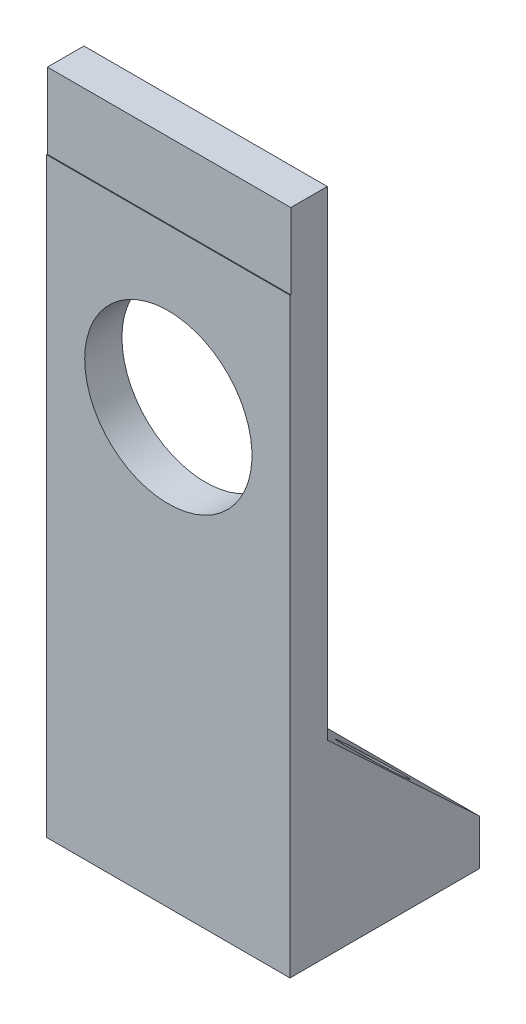
ISO-10303-21;
HEADER;
FILE_DESCRIPTION(('STEP AP214'),'2;1');
FILE_NAME('part.step','',(''),(''),'','','');
FILE_SCHEMA(('AUTOMOTIVE_DESIGN { 1 0 10303 214 1 1 1 1 }'));
ENDSEC;
DATA;
#1=APPLICATION_CONTEXT('core data for automotive mechanical design processes');
#2=APPLICATION_PROTOCOL_DEFINITION('international standard','automotive_design',2000,#1);
#3=PRODUCT_CONTEXT('',#1,'mechanical');
#4=PRODUCT('Part','Part','',(#3));
#5=PRODUCT_RELATED_PRODUCT_CATEGORY('part','',(#4));
#6=PRODUCT_DEFINITION_FORMATION('','',#4);
#7=PRODUCT_DEFINITION_CONTEXT('part definition',#1,'design');
#8=PRODUCT_DEFINITION('design','',#6,#7);
#9=PRODUCT_DEFINITION_SHAPE('','',#8);
#10=(LENGTH_UNIT() NAMED_UNIT(*) SI_UNIT(.MILLI.,.METRE.));
#11=(NAMED_UNIT(*) PLANE_ANGLE_UNIT() SI_UNIT($,.RADIAN.));
#12=(NAMED_UNIT(*) SI_UNIT($,.STERADIAN.) SOLID_ANGLE_UNIT());
#13=UNCERTAINTY_MEASURE_WITH_UNIT(LENGTH_MEASURE(1.E-05),#10,'distance_accuracy_value','');
#14=(GEOMETRIC_REPRESENTATION_CONTEXT(3) GLOBAL_UNCERTAINTY_ASSIGNED_CONTEXT((#13)) GLOBAL_UNIT_ASSIGNED_CONTEXT((#10,
#11,#12)) REPRESENTATION_CONTEXT('',''));
#15=CARTESIAN_POINT('',(0.,0.,0.));
#16=DIRECTION('',(0.,0.,1.));
#17=DIRECTION('',(1.,0.,0.));
#18=AXIS2_PLACEMENT_3D('',#15,#16,#17);
#19=CARTESIAN_POINT('',(0.,0.,0.));
#20=DIRECTION('',(0.,0.,1.));
#21=DIRECTION('',(1.,0.,0.));
#22=AXIS2_PLACEMENT_3D('',#19,#20,#21);
#23=PLANE('',#22);
#24=CARTESIAN_POINT('',(70.,72.0000000000001,0.));
#25=DIRECTION('',(0.,0.,1.));
#26=DIRECTION('',(1.,0.,0.));
#27=AXIS2_PLACEMENT_3D('',#24,#25,#26);
#28=CIRCLE('',#27,11.);
#29=CARTESIAN_POINT('',(81.,72.0000000000001,0.));
#30=VERTEX_POINT('',#29);
#31=EDGE_CURVE('E167',#30,#30,#28,.T.);
#32=ORIENTED_EDGE('',*,*,#31,.T.);
#33=EDGE_LOOP('',(#32));
#34=FACE_BOUND('',#33,.T.);
#35=DIRECTION('',(0.,1.,0.));
#36=VECTOR('',#35,1.);
#37=CARTESIAN_POINT('',(86.,102.7,0.));
#38=LINE('',#37,#36);
#39=CARTESIAN_POINT('',(86.,39.631523057082,0.));
#40=VERTEX_POINT('',#39);
#41=CARTESIAN_POINT('',(86.,102.7,0.));
#42=VERTEX_POINT('',#41);
#43=EDGE_CURVE('E145',#40,#42,#38,.T.);
#44=ORIENTED_EDGE('',*,*,#43,.F.);
#45=DIRECTION('',(1.,0.,0.));
#46=VECTOR('',#45,1.);
#47=CARTESIAN_POINT('',(54.,39.6315230570821,0.));
#48=LINE('',#47,#46);
#49=CARTESIAN_POINT('',(54.,39.6315230570821,0.));
#50=VERTEX_POINT('',#49);
#51=EDGE_CURVE('E124',#50,#40,#48,.T.);
#52=ORIENTED_EDGE('',*,*,#51,.F.);
#53=DIRECTION('',(0.,-1.,0.));
#54=VECTOR('',#53,1.);
#55=CARTESIAN_POINT('',(54.,0.,0.));
#56=LINE('',#55,#54);
#57=CARTESIAN_POINT('',(54.,102.7,0.));
#58=VERTEX_POINT('',#57);
#59=EDGE_CURVE('E123',#58,#50,#56,.T.);
#60=ORIENTED_EDGE('',*,*,#59,.F.);
#61=DIRECTION('',(-1.,0.,0.));
#62=VECTOR('',#61,1.);
#63=CARTESIAN_POINT('',(0.,102.7,0.));
#64=LINE('',#63,#62);
#65=EDGE_CURVE('E164',#42,#58,#64,.T.);
#66=ORIENTED_EDGE('',*,*,#65,.F.);
#67=EDGE_LOOP('',(#44,#52,#60,#66));
#68=FACE_BOUND('',#67,.T.);
#69=ADVANCED_FACE('F35',(#34,#68),#23,.F.);
#70=CARTESIAN_POINT('',(0.,0.,4.8));
#71=DIRECTION('',(0.,0.,1.));
#72=DIRECTION('',(1.,0.,0.));
#73=AXIS2_PLACEMENT_3D('',#70,#71,#72);
#74=PLANE('',#73);
#75=DIRECTION('',(0.,-1.,0.));
#76=VECTOR('',#75,1.);
#77=CARTESIAN_POINT('',(86.,0.,4.8));
#78=LINE('',#77,#76);
#79=CARTESIAN_POINT('',(86.,102.7,4.8));
#80=VERTEX_POINT('',#79);
#81=CARTESIAN_POINT('',(86.,92.7631774285374,4.79999999999999));
#82=VERTEX_POINT('',#81);
#83=EDGE_CURVE('E153',#80,#82,#78,.T.);
#84=ORIENTED_EDGE('',*,*,#83,.F.);
#85=DIRECTION('',(-1.,0.,0.));
#86=VECTOR('',#85,1.);
#87=CARTESIAN_POINT('',(0.,102.7,4.8));
#88=LINE('',#87,#86);
#89=CARTESIAN_POINT('',(54.,102.7,4.8));
#90=VERTEX_POINT('',#89);
#91=EDGE_CURVE('E165',#80,#90,#88,.T.);
#92=ORIENTED_EDGE('',*,*,#91,.T.);
#93=DIRECTION('',(0.,1.,0.));
#94=VECTOR('',#93,1.);
#95=CARTESIAN_POINT('',(54.,0.,4.8));
#96=LINE('',#95,#94);
#97=CARTESIAN_POINT('',(54.,92.7631774285374,4.79999999999999));
#98=VERTEX_POINT('',#97);
#99=EDGE_CURVE('E159',#98,#90,#96,.T.);
#100=ORIENTED_EDGE('',*,*,#99,.F.);
#101=DIRECTION('',(1.,0.,0.));
#102=VECTOR('',#101,1.);
#103=CARTESIAN_POINT('',(0.,92.7631774285374,4.8));
#104=LINE('',#103,#102);
#105=EDGE_CURVE('E161',#98,#82,#104,.T.);
#106=ORIENTED_EDGE('',*,*,#105,.T.);
#107=EDGE_LOOP('',(#84,#92,#100,#106));
#108=FACE_BOUND('',#107,.T.);
#109=ADVANCED_FACE('F209',(#108),#74,.T.);
#110=CARTESIAN_POINT('',(0.,102.7,4.8));
#111=DIRECTION('',(0.,-1.,0.));
#112=DIRECTION('',(1.,0.,0.));
#113=AXIS2_PLACEMENT_3D('',#110,#111,#112);
#114=PLANE('',#113);
#115=ORIENTED_EDGE('',*,*,#91,.F.);
#116=DIRECTION('',(0.,0.,-1.));
#117=VECTOR('',#116,1.);
#118=CARTESIAN_POINT('',(86.,102.7,100.));
#119=LINE('',#118,#117);
#120=EDGE_CURVE('E147',#80,#42,#119,.T.);
#121=ORIENTED_EDGE('',*,*,#120,.T.);
#122=ORIENTED_EDGE('',*,*,#65,.T.);
#123=DIRECTION('',(0.,0.,-1.));
#124=VECTOR('',#123,1.);
#125=CARTESIAN_POINT('',(54.,102.7,100.));
#126=LINE('',#125,#124);
#127=EDGE_CURVE('E156',#90,#58,#126,.T.);
#128=ORIENTED_EDGE('',*,*,#127,.F.);
#129=EDGE_LOOP('',(#115,#121,#122,#128));
#130=FACE_BOUND('',#129,.T.);
#131=ADVANCED_FACE('F37',(#130),#114,.F.);
#132=CARTESIAN_POINT('',(70.,72.0000000000001,4.8));
#133=DIRECTION('',(0.,0.,-1.));
#134=DIRECTION('',(-1.,0.,0.));
#135=AXIS2_PLACEMENT_3D('',#132,#133,#134);
#136=CYLINDRICAL_SURFACE('',#135,11.);
#137=CARTESIAN_POINT('',(70.,72.0000000000001,4.9));
#138=DIRECTION('',(0.,0.,-1.));
#139=DIRECTION('',(-1.,0.,0.));
#140=AXIS2_PLACEMENT_3D('',#137,#138,#139);
#141=CIRCLE('',#140,11.);
#142=CARTESIAN_POINT('',(59.,72.0000000000001,4.9));
#143=VERTEX_POINT('',#142);
#144=EDGE_CURVE('E142',#143,#143,#141,.T.);
#145=ORIENTED_EDGE('',*,*,#144,.F.);
#146=EDGE_LOOP('',(#145));
#147=FACE_BOUND('',#146,.T.);
#148=ORIENTED_EDGE('',*,*,#31,.F.);
#149=EDGE_LOOP('',(#148));
#150=FACE_BOUND('',#149,.T.);
#151=ADVANCED_FACE('F223',(#147,#150),#136,.F.);
#152=CARTESIAN_POINT('',(0.,92.7631774285374,13.));
#153=DIRECTION('',(0.,1.,0.));
#154=DIRECTION('',(-1.,0.,0.));
#155=AXIS2_PLACEMENT_3D('',#152,#153,#154);
#156=PLANE('',#155);
#157=DIRECTION('',(1.,0.,0.));
#158=VECTOR('',#157,1.);
#159=CARTESIAN_POINT('',(-14.,92.7631774285374,4.9));
#160=LINE('',#159,#158);
#161=CARTESIAN_POINT('',(54.,92.7631774285374,4.9));
#162=VERTEX_POINT('',#161);
#163=CARTESIAN_POINT('',(86.,92.7631774285374,4.9));
#164=VERTEX_POINT('',#163);
#165=EDGE_CURVE('E136',#162,#164,#160,.T.);
#166=ORIENTED_EDGE('',*,*,#165,.T.);
#167=DIRECTION('',(0.,0.,1.));
#168=VECTOR('',#167,1.);
#169=CARTESIAN_POINT('',(86.,92.7631774285374,13.));
#170=LINE('',#169,#168);
#171=EDGE_CURVE('E150',#82,#164,#170,.T.);
#172=ORIENTED_EDGE('',*,*,#171,.F.);
#173=ORIENTED_EDGE('',*,*,#105,.F.);
#174=DIRECTION('',(0.,0.,-1.));
#175=VECTOR('',#174,1.);
#176=CARTESIAN_POINT('',(54.,92.7631774285374,13.));
#177=LINE('',#176,#175);
#178=EDGE_CURVE('E60',#162,#98,#177,.T.);
#179=ORIENTED_EDGE('',*,*,#178,.F.);
#180=EDGE_LOOP('',(#166,#172,#173,#179));
#181=FACE_BOUND('',#180,.T.);
#182=ADVANCED_FACE('F205',(#181),#156,.T.);
#183=CARTESIAN_POINT('',(0.,15.,-90.2));
#184=DIRECTION('',(0.,1.,0.));
#185=DIRECTION('',(0.,0.,1.));
#186=AXIS2_PLACEMENT_3D('',#183,#184,#185);
#187=PLANE('',#186);
#188=CARTESIAN_POINT('',(80.,15.,-12.));
#189=DIRECTION('',(0.,1.,0.));
#190=DIRECTION('',(0.,0.,1.));
#191=AXIS2_PLACEMENT_3D('',#188,#189,#190);
#192=CIRCLE('',#191,2.);
#193=CARTESIAN_POINT('',(80.,15.,-10.));
#194=VERTEX_POINT('',#193);
#195=EDGE_CURVE('E196',#194,#194,#192,.T.);
#196=ORIENTED_EDGE('',*,*,#195,.T.);
#197=EDGE_LOOP('',(#196));
#198=FACE_BOUND('',#197,.T.);
#199=CARTESIAN_POINT('',(60.,15.,-12.));
#200=DIRECTION('',(0.,1.,0.));
#201=DIRECTION('',(0.,0.,1.));
#202=AXIS2_PLACEMENT_3D('',#199,#200,#201);
#203=CIRCLE('',#202,2.);
#204=CARTESIAN_POINT('',(60.,15.,-10.));
#205=VERTEX_POINT('',#204);
#206=EDGE_CURVE('E189',#205,#205,#203,.T.);
#207=ORIENTED_EDGE('',*,*,#206,.T.);
#208=EDGE_LOOP('',(#207));
#209=FACE_BOUND('',#208,.T.);
#210=DIRECTION('',(0.,0.,1.));
#211=VECTOR('',#210,1.);
#212=CARTESIAN_POINT('',(86.,15.,-90.2));
#213=LINE('',#212,#211);
#214=CARTESIAN_POINT('',(86.,15.,-20.));
#215=VERTEX_POINT('',#214);
#216=CARTESIAN_POINT('',(86.,15.,4.9));
#217=VERTEX_POINT('',#216);
#218=EDGE_CURVE('E11',#215,#217,#213,.T.);
#219=ORIENTED_EDGE('',*,*,#218,.T.);
#220=DIRECTION('',(1.,0.,0.));
#221=VECTOR('',#220,1.);
#222=CARTESIAN_POINT('',(-14.,15.,4.9));
#223=LINE('',#222,#221);
#224=CARTESIAN_POINT('',(54.,15.,4.9));
#225=VERTEX_POINT('',#224);
#226=EDGE_CURVE('E52',#225,#217,#223,.T.);
#227=ORIENTED_EDGE('',*,*,#226,.F.);
#228=DIRECTION('',(0.,0.,-1.));
#229=VECTOR('',#228,1.);
#230=CARTESIAN_POINT('',(54.,15.,-90.2));
#231=LINE('',#230,#229);
#232=CARTESIAN_POINT('',(54.,15.,-20.));
#233=VERTEX_POINT('',#232);
#234=EDGE_CURVE('E44',#225,#233,#231,.T.);
#235=ORIENTED_EDGE('',*,*,#234,.T.);
#236=DIRECTION('',(-1.,0.,0.));
#237=VECTOR('',#236,1.);
#238=CARTESIAN_POINT('',(86.,15.,-20.));
#239=LINE('',#238,#237);
#240=EDGE_CURVE('E129',#215,#233,#239,.T.);
#241=ORIENTED_EDGE('',*,*,#240,.F.);
#242=EDGE_LOOP('',(#219,#227,#235,#241));
#243=FACE_BOUND('',#242,.T.);
#244=ADVANCED_FACE('F202',(#198,#209,#243),#187,.F.);
#245=CARTESIAN_POINT('',(54.,0.,100.));
#246=DIRECTION('',(1.,0.,0.));
#247=DIRECTION('',(0.,1.,0.));
#248=AXIS2_PLACEMENT_3D('',#245,#246,#247);
#249=PLANE('',#248);
#250=ORIENTED_EDGE('',*,*,#234,.F.);
#251=DIRECTION('',(0.,1.,0.));
#252=VECTOR('',#251,1.);
#253=CARTESIAN_POINT('',(54.,0.,4.9));
#254=LINE('',#253,#252);
#255=EDGE_CURVE('E139',#225,#162,#254,.T.);
#256=ORIENTED_EDGE('',*,*,#255,.T.);
#257=ORIENTED_EDGE('',*,*,#178,.T.);
#258=ORIENTED_EDGE('',*,*,#99,.T.);
#259=ORIENTED_EDGE('',*,*,#127,.T.);
#260=ORIENTED_EDGE('',*,*,#59,.T.);
#261=DIRECTION('',(0.,0.681630805143284,0.731696279531145));
#262=VECTOR('',#261,1.);
#263=CARTESIAN_POINT('',(54.,21.,-20.));
#264=LINE('',#263,#262);
#265=CARTESIAN_POINT('',(54.,21.,-20.));
#266=VERTEX_POINT('',#265);
#267=EDGE_CURVE('E106',#266,#50,#264,.T.);
#268=ORIENTED_EDGE('',*,*,#267,.F.);
#269=DIRECTION('',(0.,1.,0.));
#270=VECTOR('',#269,1.);
#271=CARTESIAN_POINT('',(54.,15.,-20.));
#272=LINE('',#271,#270);
#273=EDGE_CURVE('E115',#233,#266,#272,.T.);
#274=ORIENTED_EDGE('',*,*,#273,.F.);
#275=EDGE_LOOP('',(#250,#256,#257,#258,#259,#260,#268,#274));
#276=FACE_BOUND('',#275,.T.);
#277=ADVANCED_FACE('F120',(#276),#249,.F.);
#278=CARTESIAN_POINT('',(86.,102.7,100.));
#279=DIRECTION('',(-1.,0.,0.));
#280=DIRECTION('',(0.,-1.,0.));
#281=AXIS2_PLACEMENT_3D('',#278,#279,#280);
#282=PLANE('',#281);
#283=DIRECTION('',(0.,0.681630805143284,0.731696279531145));
#284=VECTOR('',#283,1.);
#285=CARTESIAN_POINT('',(86.,21.,-20.));
#286=LINE('',#285,#284);
#287=CARTESIAN_POINT('',(86.,21.,-20.));
#288=VERTEX_POINT('',#287);
#289=EDGE_CURVE('E109',#288,#40,#286,.T.);
#290=ORIENTED_EDGE('',*,*,#289,.T.);
#291=ORIENTED_EDGE('',*,*,#43,.T.);
#292=ORIENTED_EDGE('',*,*,#120,.F.);
#293=ORIENTED_EDGE('',*,*,#83,.T.);
#294=ORIENTED_EDGE('',*,*,#171,.T.);
#295=DIRECTION('',(0.,1.,0.));
#296=VECTOR('',#295,1.);
#297=CARTESIAN_POINT('',(86.,92.7631774285374,4.9));
#298=LINE('',#297,#296);
#299=EDGE_CURVE('E114',#217,#164,#298,.T.);
#300=ORIENTED_EDGE('',*,*,#299,.F.);
#301=ORIENTED_EDGE('',*,*,#218,.F.);
#302=DIRECTION('',(0.,-1.,0.));
#303=VECTOR('',#302,1.);
#304=CARTESIAN_POINT('',(86.,15.,-20.));
#305=LINE('',#304,#303);
#306=EDGE_CURVE('E131',#288,#215,#305,.T.);
#307=ORIENTED_EDGE('',*,*,#306,.F.);
#308=EDGE_LOOP('',(#290,#291,#292,#293,#294,#300,#301,#307));
#309=FACE_BOUND('',#308,.T.);
#310=ADVANCED_FACE('F199',(#309),#282,.F.);
#311=CARTESIAN_POINT('',(-14.,92.7631774285374,4.9));
#312=DIRECTION('',(0.,0.,-1.));
#313=DIRECTION('',(-1.,0.,0.));
#314=AXIS2_PLACEMENT_3D('',#311,#312,#313);
#315=PLANE('',#314);
#316=ORIENTED_EDGE('',*,*,#144,.T.);
#317=EDGE_LOOP('',(#316));
#318=FACE_BOUND('',#317,.T.);
#319=ORIENTED_EDGE('',*,*,#226,.T.);
#320=ORIENTED_EDGE('',*,*,#299,.T.);
#321=ORIENTED_EDGE('',*,*,#165,.F.);
#322=ORIENTED_EDGE('',*,*,#255,.F.);
#323=EDGE_LOOP('',(#319,#320,#321,#322));
#324=FACE_BOUND('',#323,.T.);
#325=ADVANCED_FACE('F234',(#318,#324),#315,.F.);
#326=CARTESIAN_POINT('',(0.,0.,-20.));
#327=DIRECTION('',(0.,0.,1.));
#328=DIRECTION('',(0.,-1.,0.));
#329=AXIS2_PLACEMENT_3D('',#326,#327,#328);
#330=PLANE('',#329);
#331=ORIENTED_EDGE('',*,*,#306,.T.);
#332=ORIENTED_EDGE('',*,*,#240,.T.);
#333=ORIENTED_EDGE('',*,*,#273,.T.);
#334=DIRECTION('',(1.,0.,0.));
#335=VECTOR('',#334,1.);
#336=CARTESIAN_POINT('',(86.,21.,-20.));
#337=LINE('',#336,#335);
#338=EDGE_CURVE('E103',#266,#288,#337,.T.);
#339=ORIENTED_EDGE('',*,*,#338,.T.);
#340=EDGE_LOOP('',(#331,#332,#333,#339));
#341=FACE_BOUND('',#340,.T.);
#342=ADVANCED_FACE('F127',(#341),#330,.F.);
#343=CARTESIAN_POINT('',(60.,7.,-12.));
#344=DIRECTION('',(0.,1.,0.));
#345=DIRECTION('',(0.,0.,1.));
#346=AXIS2_PLACEMENT_3D('',#343,#344,#345);
#347=CYLINDRICAL_SURFACE('',#346,2.);
#348=CARTESIAN_POINT('',(60.,21.,-12.));
#349=DIRECTION('',(0.,-1.,0.));
#350=DIRECTION('',(1.,0.,0.));
#351=AXIS2_PLACEMENT_3D('',#348,#349,#350);
#352=CIRCLE('',#351,2.);
#353=CARTESIAN_POINT('',(62.,21.,-12.));
#354=VERTEX_POINT('',#353);
#355=EDGE_CURVE('E177',#354,#354,#352,.F.);
#356=ORIENTED_EDGE('',*,*,#355,.T.);
#357=EDGE_LOOP('',(#356));
#358=FACE_BOUND('',#357,.T.);
#359=ORIENTED_EDGE('',*,*,#206,.F.);
#360=EDGE_LOOP('',(#359));
#361=FACE_BOUND('',#360,.T.);
#362=ADVANCED_FACE('F241',(#358,#361),#347,.F.);
#363=CARTESIAN_POINT('',(80.,7.,-12.));
#364=DIRECTION('',(0.,1.,0.));
#365=DIRECTION('',(0.,0.,1.));
#366=AXIS2_PLACEMENT_3D('',#363,#364,#365);
#367=CYLINDRICAL_SURFACE('',#366,2.);
#368=CARTESIAN_POINT('',(80.,21.,-12.));
#369=DIRECTION('',(0.,-1.,0.));
#370=DIRECTION('',(1.,0.,0.));
#371=AXIS2_PLACEMENT_3D('',#368,#369,#370);
#372=CIRCLE('',#371,2.);
#373=CARTESIAN_POINT('',(82.,21.,-12.));
#374=VERTEX_POINT('',#373);
#375=EDGE_CURVE('E187',#374,#374,#372,.F.);
#376=ORIENTED_EDGE('',*,*,#375,.T.);
#377=EDGE_LOOP('',(#376));
#378=FACE_BOUND('',#377,.T.);
#379=ORIENTED_EDGE('',*,*,#195,.F.);
#380=EDGE_LOOP('',(#379));
#381=FACE_BOUND('',#380,.T.);
#382=ADVANCED_FACE('F257',(#378,#381),#367,.F.);
#383=CARTESIAN_POINT('',(54.,21.,-20.));
#384=DIRECTION('',(0.,0.731696279531145,-0.681630805143284));
#385=DIRECTION('',(0.,0.681630805143284,0.731696279531145));
#386=AXIS2_PLACEMENT_3D('',#383,#384,#385);
#387=PLANE('',#386);
#388=CARTESIAN_POINT('',(80.,28.4526092228328,-12.));
#389=DIRECTION('',(0.,0.731696279531145,-0.681630805143284));
#390=DIRECTION('',(0.,-0.681630805143284,-0.731696279531145));
#391=AXIS2_PLACEMENT_3D('',#388,#389,#390);
#392=ELLIPSE('',#391,4.7834054892868,3.50000000000001);
#393=CARTESIAN_POINT('',(80.,25.1920926878434,-15.5));
#394=VERTEX_POINT('',#393);
#395=EDGE_CURVE('E39',#394,#394,#392,.T.);
#396=ORIENTED_EDGE('',*,*,#395,.F.);
#397=EDGE_LOOP('',(#396));
#398=FACE_BOUND('',#397,.T.);
#399=CARTESIAN_POINT('',(60.,28.4526092228328,-12.));
#400=DIRECTION('',(0.,0.731696279531145,-0.681630805143284));
#401=DIRECTION('',(0.,-0.681630805143284,-0.731696279531145));
#402=AXIS2_PLACEMENT_3D('',#399,#400,#401);
#403=ELLIPSE('',#402,4.7834054892868,3.50000000000001);
#404=CARTESIAN_POINT('',(60.,25.1920926878435,-15.5));
#405=VERTEX_POINT('',#404);
#406=EDGE_CURVE('E171',#405,#405,#403,.T.);
#407=ORIENTED_EDGE('',*,*,#406,.F.);
#408=EDGE_LOOP('',(#407));
#409=FACE_BOUND('',#408,.T.);
#410=ORIENTED_EDGE('',*,*,#289,.F.);
#411=ORIENTED_EDGE('',*,*,#338,.F.);
#412=ORIENTED_EDGE('',*,*,#267,.T.);
#413=ORIENTED_EDGE('',*,*,#51,.T.);
#414=EDGE_LOOP('',(#410,#411,#412,#413));
#415=FACE_BOUND('',#414,.T.);
#416=ADVANCED_FACE('F105',(#398,#409,#415),#387,.T.);
#417=CARTESIAN_POINT('',(60.,21.,-12.));
#418=DIRECTION('',(0.,-1.,0.));
#419=DIRECTION('',(1.,0.,0.));
#420=AXIS2_PLACEMENT_3D('',#417,#418,#419);
#421=PLANE('',#420);
#422=CARTESIAN_POINT('',(60.,21.,-12.));
#423=DIRECTION('',(0.,-1.,0.));
#424=DIRECTION('',(1.,0.,0.));
#425=AXIS2_PLACEMENT_3D('',#422,#423,#424);
#426=CIRCLE('',#425,3.50000000000001);
#427=CARTESIAN_POINT('',(63.5,21.,-12.));
#428=VERTEX_POINT('',#427);
#429=EDGE_CURVE('E179',#428,#428,#426,.T.);
#430=ORIENTED_EDGE('',*,*,#429,.F.);
#431=EDGE_LOOP('',(#430));
#432=FACE_BOUND('',#431,.T.);
#433=ORIENTED_EDGE('',*,*,#355,.F.);
#434=EDGE_LOOP('',(#433));
#435=FACE_BOUND('',#434,.T.);
#436=ADVANCED_FACE('F267',(#432,#435),#421,.F.);
#437=CARTESIAN_POINT('',(60.,53.,-12.));
#438=DIRECTION('',(0.,-1.,0.));
#439=DIRECTION('',(1.,0.,0.));
#440=AXIS2_PLACEMENT_3D('',#437,#438,#439);
#441=CYLINDRICAL_SURFACE('',#440,3.50000000000001);
#442=ORIENTED_EDGE('',*,*,#406,.T.);
#443=EDGE_LOOP('',(#442));
#444=FACE_BOUND('',#443,.T.);
#445=ORIENTED_EDGE('',*,*,#429,.T.);
#446=EDGE_LOOP('',(#445));
#447=FACE_BOUND('',#446,.T.);
#448=ADVANCED_FACE('F269',(#444,#447),#441,.F.);
#449=CARTESIAN_POINT('',(80.,21.,-12.));
#450=DIRECTION('',(0.,-1.,0.));
#451=DIRECTION('',(1.,0.,0.));
#452=AXIS2_PLACEMENT_3D('',#449,#450,#451);
#453=PLANE('',#452);
#454=CARTESIAN_POINT('',(80.,21.,-12.));
#455=DIRECTION('',(0.,-1.,0.));
#456=DIRECTION('',(1.,0.,0.));
#457=AXIS2_PLACEMENT_3D('',#454,#455,#456);
#458=CIRCLE('',#457,3.50000000000001);
#459=CARTESIAN_POINT('',(83.5,21.,-12.));
#460=VERTEX_POINT('',#459);
#461=EDGE_CURVE('E173',#460,#460,#458,.T.);
#462=ORIENTED_EDGE('',*,*,#461,.F.);
#463=EDGE_LOOP('',(#462));
#464=FACE_BOUND('',#463,.T.);
#465=ORIENTED_EDGE('',*,*,#375,.F.);
#466=EDGE_LOOP('',(#465));
#467=FACE_BOUND('',#466,.T.);
#468=ADVANCED_FACE('F272',(#464,#467),#453,.F.);
#469=CARTESIAN_POINT('',(80.,53.,-12.));
#470=DIRECTION('',(0.,-1.,0.));
#471=DIRECTION('',(1.,0.,0.));
#472=AXIS2_PLACEMENT_3D('',#469,#470,#471);
#473=CYLINDRICAL_SURFACE('',#472,3.50000000000001);
#474=ORIENTED_EDGE('',*,*,#395,.T.);
#475=EDGE_LOOP('',(#474));
#476=FACE_BOUND('',#475,.T.);
#477=ORIENTED_EDGE('',*,*,#461,.T.);
#478=EDGE_LOOP('',(#477));
#479=FACE_BOUND('',#478,.T.);
#480=ADVANCED_FACE('F276',(#476,#479),#473,.F.);
#481=CLOSED_SHELL('',(#69,#109,#131,#151,#182,#244,#277,#310,#325,#342,#362,#382,#416,#436,#448,
#468,#480));
#482=MANIFOLD_SOLID_BREP('B2',#481);
#483=ADVANCED_BREP_SHAPE_REPRESENTATION('',(#18,#482),#14);
#484=SHAPE_DEFINITION_REPRESENTATION(#9,#483);
ENDSEC;
END-ISO-10303-21;
